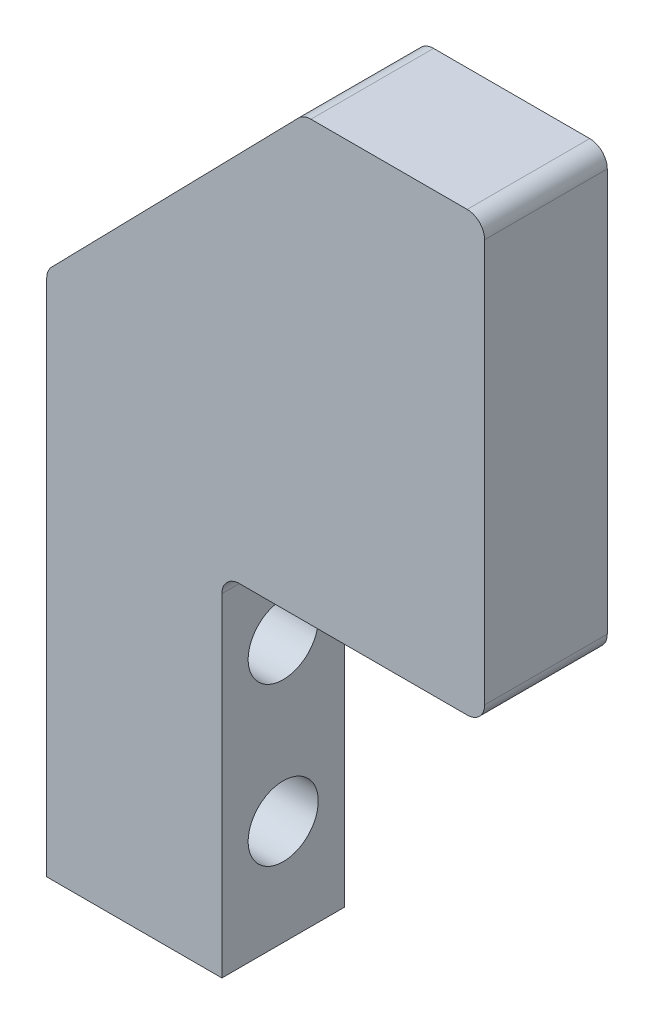
ISO-10303-21;
HEADER;
FILE_DESCRIPTION(('STEP AP214'),'2;1');
FILE_NAME('part.step','',(''),(''),'','','');
FILE_SCHEMA(('AUTOMOTIVE_DESIGN { 1 0 10303 214 1 1 1 1 }'));
ENDSEC;
DATA;
#1=APPLICATION_CONTEXT('core data for automotive mechanical design processes');
#2=APPLICATION_PROTOCOL_DEFINITION('international standard','automotive_design',2000,#1);
#3=PRODUCT_CONTEXT('',#1,'mechanical');
#4=PRODUCT('Part','Part','',(#3));
#5=PRODUCT_RELATED_PRODUCT_CATEGORY('part','',(#4));
#6=PRODUCT_DEFINITION_FORMATION('','',#4);
#7=PRODUCT_DEFINITION_CONTEXT('part definition',#1,'design');
#8=PRODUCT_DEFINITION('design','',#6,#7);
#9=PRODUCT_DEFINITION_SHAPE('','',#8);
#10=(LENGTH_UNIT() NAMED_UNIT(*) SI_UNIT(.MILLI.,.METRE.));
#11=(NAMED_UNIT(*) PLANE_ANGLE_UNIT() SI_UNIT($,.RADIAN.));
#12=(NAMED_UNIT(*) SI_UNIT($,.STERADIAN.) SOLID_ANGLE_UNIT());
#13=UNCERTAINTY_MEASURE_WITH_UNIT(LENGTH_MEASURE(1.E-05),#10,'distance_accuracy_value','');
#14=(GEOMETRIC_REPRESENTATION_CONTEXT(3) GLOBAL_UNCERTAINTY_ASSIGNED_CONTEXT((#13)) GLOBAL_UNIT_ASSIGNED_CONTEXT((#10,
#11,#12)) REPRESENTATION_CONTEXT('',''));
#15=CARTESIAN_POINT('',(0.,0.,0.));
#16=DIRECTION('',(0.,0.,1.));
#17=DIRECTION('',(1.,0.,0.));
#18=AXIS2_PLACEMENT_3D('',#15,#16,#17);
#19=CARTESIAN_POINT('',(52.7929687499999,181.162109375,70.));
#20=DIRECTION('',(0.,0.,-1.));
#21=DIRECTION('',(-1.,0.,0.));
#22=AXIS2_PLACEMENT_3D('',#19,#20,#21);
#23=CYLINDRICAL_SURFACE('',#22,10.);
#24=CARTESIAN_POINT('',(52.7929687499999,181.162109375,0.));
#25=DIRECTION('',(0.,0.,1.));
#26=DIRECTION('',(1.,0.,0.));
#27=AXIS2_PLACEMENT_3D('',#24,#25,#26);
#28=CIRCLE('',#27,10.);
#29=CARTESIAN_POINT('',(62.7929687499999,181.162109375,0.));
#30=VERTEX_POINT('',#29);
#31=CARTESIAN_POINT('',(52.7929687499999,191.162109375,0.));
#32=VERTEX_POINT('',#31);
#33=EDGE_CURVE('E159',#30,#32,#28,.T.);
#34=ORIENTED_EDGE('',*,*,#33,.T.);
#35=DIRECTION('',(0.,0.,-1.));
#36=VECTOR('',#35,1.);
#37=CARTESIAN_POINT('',(52.7929687499999,191.162109375,70.));
#38=LINE('',#37,#36);
#39=CARTESIAN_POINT('',(52.7929687499999,191.162109375,70.));
#40=VERTEX_POINT('',#39);
#41=EDGE_CURVE('E11',#40,#32,#38,.T.);
#42=ORIENTED_EDGE('',*,*,#41,.F.);
#43=CARTESIAN_POINT('',(52.7929687499999,181.162109375,70.));
#44=DIRECTION('',(0.,0.,1.));
#45=DIRECTION('',(1.,0.,0.));
#46=AXIS2_PLACEMENT_3D('',#43,#44,#45);
#47=CIRCLE('',#46,10.);
#48=CARTESIAN_POINT('',(62.7929687499999,181.162109375,70.));
#49=VERTEX_POINT('',#48);
#50=EDGE_CURVE('E182',#49,#40,#47,.T.);
#51=ORIENTED_EDGE('',*,*,#50,.F.);
#52=DIRECTION('',(0.,0.,-1.));
#53=VECTOR('',#52,1.);
#54=CARTESIAN_POINT('',(62.7929687499999,181.162109375,70.));
#55=LINE('',#54,#53);
#56=EDGE_CURVE('E155',#49,#30,#55,.T.);
#57=ORIENTED_EDGE('',*,*,#56,.T.);
#58=EDGE_LOOP('',(#34,#42,#51,#57));
#59=FACE_BOUND('',#58,.T.);
#60=ADVANCED_FACE('F39',(#59),#23,.T.);
#61=CARTESIAN_POINT('',(-36.3758964673561,191.162109375,70.));
#62=DIRECTION('',(0.,-1.,0.));
#63=DIRECTION('',(0.,0.,-1.));
#64=AXIS2_PLACEMENT_3D('',#61,#62,#63);
#65=PLANE('',#64);
#66=DIRECTION('',(-1.,0.,0.));
#67=VECTOR('',#66,1.);
#68=CARTESIAN_POINT('',(-36.3758964673561,191.162109375,0.));
#69=LINE('',#68,#67);
#70=CARTESIAN_POINT('',(-36.3758964673561,191.162109375,0.));
#71=VERTEX_POINT('',#70);
#72=EDGE_CURVE('E162',#32,#71,#69,.T.);
#73=ORIENTED_EDGE('',*,*,#72,.T.);
#74=DIRECTION('',(0.,0.,-1.));
#75=VECTOR('',#74,1.);
#76=CARTESIAN_POINT('',(-36.3758964673561,191.162109375,70.));
#77=LINE('',#76,#75);
#78=CARTESIAN_POINT('',(-36.3758964673561,191.162109375,70.));
#79=VERTEX_POINT('',#78);
#80=EDGE_CURVE('E47',#79,#71,#77,.T.);
#81=ORIENTED_EDGE('',*,*,#80,.F.);
#82=DIRECTION('',(-1.,0.,0.));
#83=VECTOR('',#82,1.);
#84=CARTESIAN_POINT('',(-36.3758964673561,191.162109375,70.));
#85=LINE('',#84,#83);
#86=EDGE_CURVE('E110',#40,#79,#85,.T.);
#87=ORIENTED_EDGE('',*,*,#86,.F.);
#88=ORIENTED_EDGE('',*,*,#41,.T.);
#89=EDGE_LOOP('',(#73,#81,#87,#88));
#90=FACE_BOUND('',#89,.T.);
#91=ADVANCED_FACE('F260',(#90),#65,.F.);
#92=CARTESIAN_POINT('',(-36.3758964673562,181.162109375,70.));
#93=DIRECTION('',(0.,0.,-1.));
#94=DIRECTION('',(-1.,0.,0.));
#95=AXIS2_PLACEMENT_3D('',#92,#93,#94);
#96=CYLINDRICAL_SURFACE('',#95,10.);
#97=CARTESIAN_POINT('',(-36.3758964673562,181.162109375,0.));
#98=DIRECTION('',(0.,0.,1.));
#99=DIRECTION('',(-1.,0.,0.));
#100=AXIS2_PLACEMENT_3D('',#97,#98,#99);
#101=CIRCLE('',#100,10.);
#102=CARTESIAN_POINT('',(-43.527024297738,188.152200272373,0.));
#103=VERTEX_POINT('',#102);
#104=EDGE_CURVE('E165',#71,#103,#101,.T.);
#105=ORIENTED_EDGE('',*,*,#104,.T.);
#106=DIRECTION('',(0.,0.,-1.));
#107=VECTOR('',#106,1.);
#108=CARTESIAN_POINT('',(-43.527024297738,188.152200272373,70.));
#109=LINE('',#108,#107);
#110=CARTESIAN_POINT('',(-43.527024297738,188.152200272373,70.));
#111=VERTEX_POINT('',#110);
#112=EDGE_CURVE('E201',#111,#103,#109,.T.);
#113=ORIENTED_EDGE('',*,*,#112,.F.);
#114=CARTESIAN_POINT('',(-36.3758964673562,181.162109375,70.));
#115=DIRECTION('',(0.,0.,1.));
#116=DIRECTION('',(-1.,0.,0.));
#117=AXIS2_PLACEMENT_3D('',#114,#115,#116);
#118=CIRCLE('',#117,10.);
#119=EDGE_CURVE('E209',#79,#111,#118,.T.);
#120=ORIENTED_EDGE('',*,*,#119,.F.);
#121=ORIENTED_EDGE('',*,*,#80,.T.);
#122=EDGE_LOOP('',(#105,#113,#120,#121));
#123=FACE_BOUND('',#122,.T.);
#124=ADVANCED_FACE('F207',(#123),#96,.T.);
#125=CARTESIAN_POINT('',(-43.527024297738,188.152200272373,70.));
#126=DIRECTION('',(0.715112783038182,-0.699009089737312,0.));
#127=DIRECTION('',(0.699009089737312,0.715112783038182,0.));
#128=AXIS2_PLACEMENT_3D('',#125,#126,#127);
#129=PLANE('',#128);
#130=DIRECTION('',(-0.699009089737312,-0.715112783038182,0.));
#131=VECTOR('',#130,1.);
#132=CARTESIAN_POINT('',(-43.527024297738,188.152200272373,0.));
#133=LINE('',#132,#131);
#134=CARTESIAN_POINT('',(-184.358159080382,44.0766135433239,0.));
#135=VERTEX_POINT('',#134);
#136=EDGE_CURVE('E167',#103,#135,#133,.T.);
#137=ORIENTED_EDGE('',*,*,#136,.T.);
#138=DIRECTION('',(0.,0.,-1.));
#139=VECTOR('',#138,1.);
#140=CARTESIAN_POINT('',(-184.358159080382,44.0766135433239,70.));
#141=LINE('',#140,#139);
#142=CARTESIAN_POINT('',(-184.358159080382,44.0766135433239,70.));
#143=VERTEX_POINT('',#142);
#144=EDGE_CURVE('E198',#143,#135,#141,.T.);
#145=ORIENTED_EDGE('',*,*,#144,.F.);
#146=DIRECTION('',(-0.699009089737312,-0.715112783038182,0.));
#147=VECTOR('',#146,1.);
#148=CARTESIAN_POINT('',(-43.527024297738,188.152200272373,70.));
#149=LINE('',#148,#147);
#150=EDGE_CURVE('E227',#111,#143,#149,.T.);
#151=ORIENTED_EDGE('',*,*,#150,.F.);
#152=ORIENTED_EDGE('',*,*,#112,.T.);
#153=EDGE_LOOP('',(#137,#145,#151,#152));
#154=FACE_BOUND('',#153,.T.);
#155=ADVANCED_FACE('F218',(#154),#129,.F.);
#156=CARTESIAN_POINT('',(-177.20703125,37.0865226459508,70.));
#157=DIRECTION('',(0.,0.,-1.));
#158=DIRECTION('',(-1.,0.,0.));
#159=AXIS2_PLACEMENT_3D('',#156,#157,#158);
#160=CYLINDRICAL_SURFACE('',#159,10.);
#161=CARTESIAN_POINT('',(-177.20703125,37.0865226459508,0.));
#162=DIRECTION('',(0.,0.,1.));
#163=DIRECTION('',(-1.,0.,0.));
#164=AXIS2_PLACEMENT_3D('',#161,#162,#163);
#165=CIRCLE('',#164,10.);
#166=CARTESIAN_POINT('',(-187.20703125,37.0865226459507,0.));
#167=VERTEX_POINT('',#166);
#168=EDGE_CURVE('E169',#135,#167,#165,.T.);
#169=ORIENTED_EDGE('',*,*,#168,.T.);
#170=DIRECTION('',(0.,0.,-1.));
#171=VECTOR('',#170,1.);
#172=CARTESIAN_POINT('',(-187.20703125,37.0865226459507,70.));
#173=LINE('',#172,#171);
#174=CARTESIAN_POINT('',(-187.20703125,37.0865226459507,70.));
#175=VERTEX_POINT('',#174);
#176=EDGE_CURVE('E195',#175,#167,#173,.T.);
#177=ORIENTED_EDGE('',*,*,#176,.F.);
#178=CARTESIAN_POINT('',(-177.20703125,37.0865226459508,70.));
#179=DIRECTION('',(0.,0.,1.));
#180=DIRECTION('',(-1.,0.,0.));
#181=AXIS2_PLACEMENT_3D('',#178,#179,#180);
#182=CIRCLE('',#181,10.);
#183=EDGE_CURVE('E224',#143,#175,#182,.T.);
#184=ORIENTED_EDGE('',*,*,#183,.F.);
#185=ORIENTED_EDGE('',*,*,#144,.T.);
#186=EDGE_LOOP('',(#169,#177,#184,#185));
#187=FACE_BOUND('',#186,.T.);
#188=ADVANCED_FACE('F222',(#187),#160,.T.);
#189=CARTESIAN_POINT('',(-187.20703125,37.0865226459507,70.));
#190=DIRECTION('',(1.,0.,0.));
#191=DIRECTION('',(0.,1.,0.));
#192=AXIS2_PLACEMENT_3D('',#189,#190,#191);
#193=PLANE('',#192);
#194=CARTESIAN_POINT('',(-187.20703125,-108.837890625,35.));
#195=DIRECTION('',(1.,0.,0.));
#196=DIRECTION('',(0.,1.,0.));
#197=AXIS2_PLACEMENT_3D('',#194,#195,#196);
#198=CIRCLE('',#197,20.);
#199=CARTESIAN_POINT('',(-187.20703125,-88.837890625,35.));
#200=VERTEX_POINT('',#199);
#201=EDGE_CURVE('E163',#200,#200,#198,.T.);
#202=ORIENTED_EDGE('',*,*,#201,.T.);
#203=EDGE_LOOP('',(#202));
#204=FACE_BOUND('',#203,.T.);
#205=CARTESIAN_POINT('',(-187.20703125,-198.837890625,35.));
#206=DIRECTION('',(1.,0.,0.));
#207=DIRECTION('',(0.,1.,0.));
#208=AXIS2_PLACEMENT_3D('',#205,#206,#207);
#209=CIRCLE('',#208,20.);
#210=CARTESIAN_POINT('',(-187.20703125,-178.837890625,35.));
#211=VERTEX_POINT('',#210);
#212=EDGE_CURVE('E343',#211,#211,#209,.T.);
#213=ORIENTED_EDGE('',*,*,#212,.T.);
#214=EDGE_LOOP('',(#213));
#215=FACE_BOUND('',#214,.T.);
#216=DIRECTION('',(0.,-1.,0.));
#217=VECTOR('',#216,1.);
#218=CARTESIAN_POINT('',(-187.20703125,37.0865226459507,0.));
#219=LINE('',#218,#217);
#220=CARTESIAN_POINT('',(-187.20703125,-258.837890625,0.));
#221=VERTEX_POINT('',#220);
#222=EDGE_CURVE('E171',#167,#221,#219,.T.);
#223=ORIENTED_EDGE('',*,*,#222,.T.);
#224=DIRECTION('',(0.,0.,-1.));
#225=VECTOR('',#224,1.);
#226=CARTESIAN_POINT('',(-187.20703125,-258.837890625,70.));
#227=LINE('',#226,#225);
#228=CARTESIAN_POINT('',(-187.20703125,-258.837890625,70.));
#229=VERTEX_POINT('',#228);
#230=EDGE_CURVE('E192',#229,#221,#227,.T.);
#231=ORIENTED_EDGE('',*,*,#230,.F.);
#232=DIRECTION('',(0.,-1.,0.));
#233=VECTOR('',#232,1.);
#234=CARTESIAN_POINT('',(-187.20703125,37.0865226459507,70.));
#235=LINE('',#234,#233);
#236=EDGE_CURVE('E226',#175,#229,#235,.T.);
#237=ORIENTED_EDGE('',*,*,#236,.F.);
#238=ORIENTED_EDGE('',*,*,#176,.T.);
#239=EDGE_LOOP('',(#223,#231,#237,#238));
#240=FACE_BOUND('',#239,.T.);
#241=ADVANCED_FACE('F273',(#204,#215,#240),#193,.F.);
#242=CARTESIAN_POINT('',(-187.20703125,-258.837890625,70.));
#243=DIRECTION('',(0.,1.,0.));
#244=DIRECTION('',(0.,0.,1.));
#245=AXIS2_PLACEMENT_3D('',#242,#243,#244);
#246=PLANE('',#245);
#247=DIRECTION('',(1.,0.,0.));
#248=VECTOR('',#247,1.);
#249=CARTESIAN_POINT('',(-187.20703125,-258.837890625,0.));
#250=LINE('',#249,#248);
#251=CARTESIAN_POINT('',(-87.20703125,-258.837890625,0.));
#252=VERTEX_POINT('',#251);
#253=EDGE_CURVE('E173',#221,#252,#250,.T.);
#254=ORIENTED_EDGE('',*,*,#253,.T.);
#255=DIRECTION('',(0.,0.,-1.));
#256=VECTOR('',#255,1.);
#257=CARTESIAN_POINT('',(-87.20703125,-258.837890625,70.));
#258=LINE('',#257,#256);
#259=CARTESIAN_POINT('',(-87.20703125,-258.837890625,70.));
#260=VERTEX_POINT('',#259);
#261=EDGE_CURVE('E189',#260,#252,#258,.T.);
#262=ORIENTED_EDGE('',*,*,#261,.F.);
#263=DIRECTION('',(1.,0.,0.));
#264=VECTOR('',#263,1.);
#265=CARTESIAN_POINT('',(-187.20703125,-258.837890625,70.));
#266=LINE('',#265,#264);
#267=EDGE_CURVE('E229',#229,#260,#266,.T.);
#268=ORIENTED_EDGE('',*,*,#267,.F.);
#269=ORIENTED_EDGE('',*,*,#230,.T.);
#270=EDGE_LOOP('',(#254,#262,#268,#269));
#271=FACE_BOUND('',#270,.T.);
#272=ADVANCED_FACE('F276',(#271),#246,.F.);
#273=CARTESIAN_POINT('',(-87.20703125,-258.837890625,70.));
#274=DIRECTION('',(-1.,0.,0.));
#275=DIRECTION('',(0.,0.,1.));
#276=AXIS2_PLACEMENT_3D('',#273,#274,#275);
#277=PLANE('',#276);
#278=CARTESIAN_POINT('',(-87.20703125,-108.837890625,35.));
#279=DIRECTION('',(1.,0.,0.));
#280=DIRECTION('',(0.,0.,-1.));
#281=AXIS2_PLACEMENT_3D('',#278,#279,#280);
#282=CIRCLE('',#281,20.);
#283=CARTESIAN_POINT('',(-87.20703125,-108.837890625,15.));
#284=VERTEX_POINT('',#283);
#285=EDGE_CURVE('E340',#284,#284,#282,.T.);
#286=ORIENTED_EDGE('',*,*,#285,.F.);
#287=EDGE_LOOP('',(#286));
#288=FACE_BOUND('',#287,.T.);
#289=CARTESIAN_POINT('',(-87.20703125,-198.837890625,35.));
#290=DIRECTION('',(1.,0.,0.));
#291=DIRECTION('',(0.,0.,-1.));
#292=AXIS2_PLACEMENT_3D('',#289,#290,#291);
#293=CIRCLE('',#292,20.);
#294=CARTESIAN_POINT('',(-87.20703125,-198.837890625,15.));
#295=VERTEX_POINT('',#294);
#296=EDGE_CURVE('E350',#295,#295,#293,.T.);
#297=ORIENTED_EDGE('',*,*,#296,.F.);
#298=EDGE_LOOP('',(#297));
#299=FACE_BOUND('',#298,.T.);
#300=DIRECTION('',(0.,1.,0.));
#301=VECTOR('',#300,1.);
#302=CARTESIAN_POINT('',(-87.20703125,-258.837890625,0.));
#303=LINE('',#302,#301);
#304=CARTESIAN_POINT('',(-87.20703125,-68.8378906250001,0.));
#305=VERTEX_POINT('',#304);
#306=EDGE_CURVE('E175',#252,#305,#303,.T.);
#307=ORIENTED_EDGE('',*,*,#306,.T.);
#308=DIRECTION('',(0.,0.,-1.));
#309=VECTOR('',#308,1.);
#310=CARTESIAN_POINT('',(-87.20703125,-68.8378906250001,70.));
#311=LINE('',#310,#309);
#312=CARTESIAN_POINT('',(-87.20703125,-68.8378906250001,70.));
#313=VERTEX_POINT('',#312);
#314=EDGE_CURVE('E186',#313,#305,#311,.T.);
#315=ORIENTED_EDGE('',*,*,#314,.F.);
#316=DIRECTION('',(0.,1.,0.));
#317=VECTOR('',#316,1.);
#318=CARTESIAN_POINT('',(-87.20703125,-258.837890625,70.));
#319=LINE('',#318,#317);
#320=EDGE_CURVE('E235',#260,#313,#319,.T.);
#321=ORIENTED_EDGE('',*,*,#320,.F.);
#322=ORIENTED_EDGE('',*,*,#261,.T.);
#323=EDGE_LOOP('',(#307,#315,#321,#322));
#324=FACE_BOUND('',#323,.T.);
#325=ADVANCED_FACE('F241',(#288,#299,#324),#277,.F.);
#326=CARTESIAN_POINT('',(-77.20703125,-68.837890625,70.));
#327=DIRECTION('',(0.,0.,-1.));
#328=DIRECTION('',(-1.,0.,0.));
#329=AXIS2_PLACEMENT_3D('',#326,#327,#328);
#330=CYLINDRICAL_SURFACE('',#329,9.99999999999999);
#331=CARTESIAN_POINT('',(-77.20703125,-68.837890625,0.));
#332=DIRECTION('',(0.,0.,-1.));
#333=DIRECTION('',(-1.,0.,0.));
#334=AXIS2_PLACEMENT_3D('',#331,#332,#333);
#335=CIRCLE('',#334,9.99999999999999);
#336=CARTESIAN_POINT('',(-77.2070312499999,-58.837890625,0.));
#337=VERTEX_POINT('',#336);
#338=EDGE_CURVE('E177',#305,#337,#335,.T.);
#339=ORIENTED_EDGE('',*,*,#338,.T.);
#340=DIRECTION('',(0.,0.,-1.));
#341=VECTOR('',#340,1.);
#342=CARTESIAN_POINT('',(-77.2070312499999,-58.837890625,70.));
#343=LINE('',#342,#341);
#344=CARTESIAN_POINT('',(-77.2070312499999,-58.837890625,70.));
#345=VERTEX_POINT('',#344);
#346=EDGE_CURVE('E150',#345,#337,#343,.T.);
#347=ORIENTED_EDGE('',*,*,#346,.F.);
#348=CARTESIAN_POINT('',(-77.20703125,-68.837890625,70.));
#349=DIRECTION('',(0.,0.,-1.));
#350=DIRECTION('',(-1.,0.,0.));
#351=AXIS2_PLACEMENT_3D('',#348,#349,#350);
#352=CIRCLE('',#351,9.99999999999999);
#353=EDGE_CURVE('E141',#313,#345,#352,.T.);
#354=ORIENTED_EDGE('',*,*,#353,.F.);
#355=ORIENTED_EDGE('',*,*,#314,.T.);
#356=EDGE_LOOP('',(#339,#347,#354,#355));
#357=FACE_BOUND('',#356,.T.);
#358=ADVANCED_FACE('F245',(#357),#330,.F.);
#359=CARTESIAN_POINT('',(-77.2070312499999,-58.837890625,70.));
#360=DIRECTION('',(0.,1.,0.));
#361=DIRECTION('',(0.,0.,1.));
#362=AXIS2_PLACEMENT_3D('',#359,#360,#361);
#363=PLANE('',#362);
#364=DIRECTION('',(1.,0.,0.));
#365=VECTOR('',#364,1.);
#366=CARTESIAN_POINT('',(-77.2070312499999,-58.837890625,0.));
#367=LINE('',#366,#365);
#368=CARTESIAN_POINT('',(52.7929687499999,-58.837890625,0.));
#369=VERTEX_POINT('',#368);
#370=EDGE_CURVE('E149',#337,#369,#367,.T.);
#371=ORIENTED_EDGE('',*,*,#370,.T.);
#372=DIRECTION('',(0.,0.,-1.));
#373=VECTOR('',#372,1.);
#374=CARTESIAN_POINT('',(52.7929687499999,-58.837890625,70.));
#375=LINE('',#374,#373);
#376=CARTESIAN_POINT('',(52.7929687499999,-58.837890625,70.));
#377=VERTEX_POINT('',#376);
#378=EDGE_CURVE('E146',#377,#369,#375,.T.);
#379=ORIENTED_EDGE('',*,*,#378,.F.);
#380=DIRECTION('',(1.,0.,0.));
#381=VECTOR('',#380,1.);
#382=CARTESIAN_POINT('',(-77.2070312499999,-58.837890625,70.));
#383=LINE('',#382,#381);
#384=EDGE_CURVE('E135',#345,#377,#383,.T.);
#385=ORIENTED_EDGE('',*,*,#384,.F.);
#386=ORIENTED_EDGE('',*,*,#346,.T.);
#387=EDGE_LOOP('',(#371,#379,#385,#386));
#388=FACE_BOUND('',#387,.T.);
#389=ADVANCED_FACE('F147',(#388),#363,.F.);
#390=CARTESIAN_POINT('',(52.79296875,-48.837890625,70.));
#391=DIRECTION('',(0.,0.,-1.));
#392=DIRECTION('',(-1.,0.,0.));
#393=AXIS2_PLACEMENT_3D('',#390,#391,#392);
#394=CYLINDRICAL_SURFACE('',#393,10.);
#395=CARTESIAN_POINT('',(52.79296875,-48.837890625,0.));
#396=DIRECTION('',(0.,0.,1.));
#397=DIRECTION('',(1.,0.,0.));
#398=AXIS2_PLACEMENT_3D('',#395,#396,#397);
#399=CIRCLE('',#398,10.);
#400=CARTESIAN_POINT('',(62.79296875,-48.8378906249999,0.));
#401=VERTEX_POINT('',#400);
#402=EDGE_CURVE('E96',#369,#401,#399,.T.);
#403=ORIENTED_EDGE('',*,*,#402,.T.);
#404=DIRECTION('',(0.,0.,-1.));
#405=VECTOR('',#404,1.);
#406=CARTESIAN_POINT('',(62.79296875,-48.8378906249999,70.));
#407=LINE('',#406,#405);
#408=CARTESIAN_POINT('',(62.79296875,-48.8378906249999,70.));
#409=VERTEX_POINT('',#408);
#410=EDGE_CURVE('E151',#409,#401,#407,.T.);
#411=ORIENTED_EDGE('',*,*,#410,.F.);
#412=CARTESIAN_POINT('',(52.79296875,-48.837890625,70.));
#413=DIRECTION('',(0.,0.,1.));
#414=DIRECTION('',(1.,0.,0.));
#415=AXIS2_PLACEMENT_3D('',#412,#413,#414);
#416=CIRCLE('',#415,10.);
#417=EDGE_CURVE('E139',#377,#409,#416,.T.);
#418=ORIENTED_EDGE('',*,*,#417,.F.);
#419=ORIENTED_EDGE('',*,*,#378,.T.);
#420=EDGE_LOOP('',(#403,#411,#418,#419));
#421=FACE_BOUND('',#420,.T.);
#422=ADVANCED_FACE('F153',(#421),#394,.T.);
#423=CARTESIAN_POINT('',(62.7929687499999,181.162109375,70.));
#424=DIRECTION('',(-1.,0.,0.));
#425=DIRECTION('',(0.,-1.,0.));
#426=AXIS2_PLACEMENT_3D('',#423,#424,#425);
#427=PLANE('',#426);
#428=DIRECTION('',(0.,1.,0.));
#429=VECTOR('',#428,1.);
#430=CARTESIAN_POINT('',(62.7929687499999,181.162109375,0.));
#431=LINE('',#430,#429);
#432=EDGE_CURVE('E102',#401,#30,#431,.T.);
#433=ORIENTED_EDGE('',*,*,#432,.T.);
#434=ORIENTED_EDGE('',*,*,#56,.F.);
#435=DIRECTION('',(0.,1.,0.));
#436=VECTOR('',#435,1.);
#437=CARTESIAN_POINT('',(62.7929687499999,181.162109375,70.));
#438=LINE('',#437,#436);
#439=EDGE_CURVE('E55',#409,#49,#438,.T.);
#440=ORIENTED_EDGE('',*,*,#439,.F.);
#441=ORIENTED_EDGE('',*,*,#410,.T.);
#442=EDGE_LOOP('',(#433,#434,#440,#441));
#443=FACE_BOUND('',#442,.T.);
#444=ADVANCED_FACE('F249',(#443),#427,.F.);
#445=CARTESIAN_POINT('',(52.7929687499999,181.162109375,70.));
#446=DIRECTION('',(0.,0.,1.));
#447=DIRECTION('',(1.,0.,0.));
#448=AXIS2_PLACEMENT_3D('',#445,#446,#447);
#449=PLANE('',#448);
#450=ORIENTED_EDGE('',*,*,#50,.T.);
#451=ORIENTED_EDGE('',*,*,#86,.T.);
#452=ORIENTED_EDGE('',*,*,#119,.T.);
#453=ORIENTED_EDGE('',*,*,#150,.T.);
#454=ORIENTED_EDGE('',*,*,#183,.T.);
#455=ORIENTED_EDGE('',*,*,#236,.T.);
#456=ORIENTED_EDGE('',*,*,#267,.T.);
#457=ORIENTED_EDGE('',*,*,#320,.T.);
#458=ORIENTED_EDGE('',*,*,#353,.T.);
#459=ORIENTED_EDGE('',*,*,#384,.T.);
#460=ORIENTED_EDGE('',*,*,#417,.T.);
#461=ORIENTED_EDGE('',*,*,#439,.T.);
#462=EDGE_LOOP('',(#450,#451,#452,#453,#454,#455,#456,#457,#458,#459,#460,#461));
#463=FACE_BOUND('',#462,.T.);
#464=ADVANCED_FACE('F137',(#463),#449,.T.);
#465=CARTESIAN_POINT('',(52.7929687499999,181.162109375,0.));
#466=DIRECTION('',(0.,0.,1.));
#467=DIRECTION('',(1.,0.,0.));
#468=AXIS2_PLACEMENT_3D('',#465,#466,#467);
#469=PLANE('',#468);
#470=ORIENTED_EDGE('',*,*,#33,.F.);
#471=ORIENTED_EDGE('',*,*,#432,.F.);
#472=ORIENTED_EDGE('',*,*,#402,.F.);
#473=ORIENTED_EDGE('',*,*,#370,.F.);
#474=ORIENTED_EDGE('',*,*,#338,.F.);
#475=ORIENTED_EDGE('',*,*,#306,.F.);
#476=ORIENTED_EDGE('',*,*,#253,.F.);
#477=ORIENTED_EDGE('',*,*,#222,.F.);
#478=ORIENTED_EDGE('',*,*,#168,.F.);
#479=ORIENTED_EDGE('',*,*,#136,.F.);
#480=ORIENTED_EDGE('',*,*,#104,.F.);
#481=ORIENTED_EDGE('',*,*,#72,.F.);
#482=EDGE_LOOP('',(#470,#471,#472,#473,#474,#475,#476,#477,#478,#479,#480,#481));
#483=FACE_BOUND('',#482,.T.);
#484=ADVANCED_FACE('F213',(#483),#469,.F.);
#485=CARTESIAN_POINT('',(-216.20703125,-198.837890625,35.));
#486=DIRECTION('',(1.,0.,0.));
#487=DIRECTION('',(0.,0.,-1.));
#488=AXIS2_PLACEMENT_3D('',#485,#486,#487);
#489=CYLINDRICAL_SURFACE('',#488,20.);
#490=ORIENTED_EDGE('',*,*,#296,.T.);
#491=EDGE_LOOP('',(#490));
#492=FACE_BOUND('',#491,.T.);
#493=ORIENTED_EDGE('',*,*,#212,.F.);
#494=EDGE_LOOP('',(#493));
#495=FACE_BOUND('',#494,.T.);
#496=ADVANCED_FACE('F316',(#492,#495),#489,.F.);
#497=CARTESIAN_POINT('',(-216.20703125,-108.837890625,35.));
#498=DIRECTION('',(1.,0.,0.));
#499=DIRECTION('',(0.,0.,-1.));
#500=AXIS2_PLACEMENT_3D('',#497,#498,#499);
#501=CYLINDRICAL_SURFACE('',#500,20.);
#502=ORIENTED_EDGE('',*,*,#285,.T.);
#503=EDGE_LOOP('',(#502));
#504=FACE_BOUND('',#503,.T.);
#505=ORIENTED_EDGE('',*,*,#201,.F.);
#506=EDGE_LOOP('',(#505));
#507=FACE_BOUND('',#506,.T.);
#508=ADVANCED_FACE('F324',(#504,#507),#501,.F.);
#509=CLOSED_SHELL('',(#60,#91,#124,#155,#188,#241,#272,#325,#358,#389,#422,#444,#464,#484,#496,#508));
#510=MANIFOLD_SOLID_BREP('B2',#509);
#511=ADVANCED_BREP_SHAPE_REPRESENTATION('',(#18,#510),#14);
#512=SHAPE_DEFINITION_REPRESENTATION(#9,#511);
ENDSEC;
END-ISO-10303-21;
